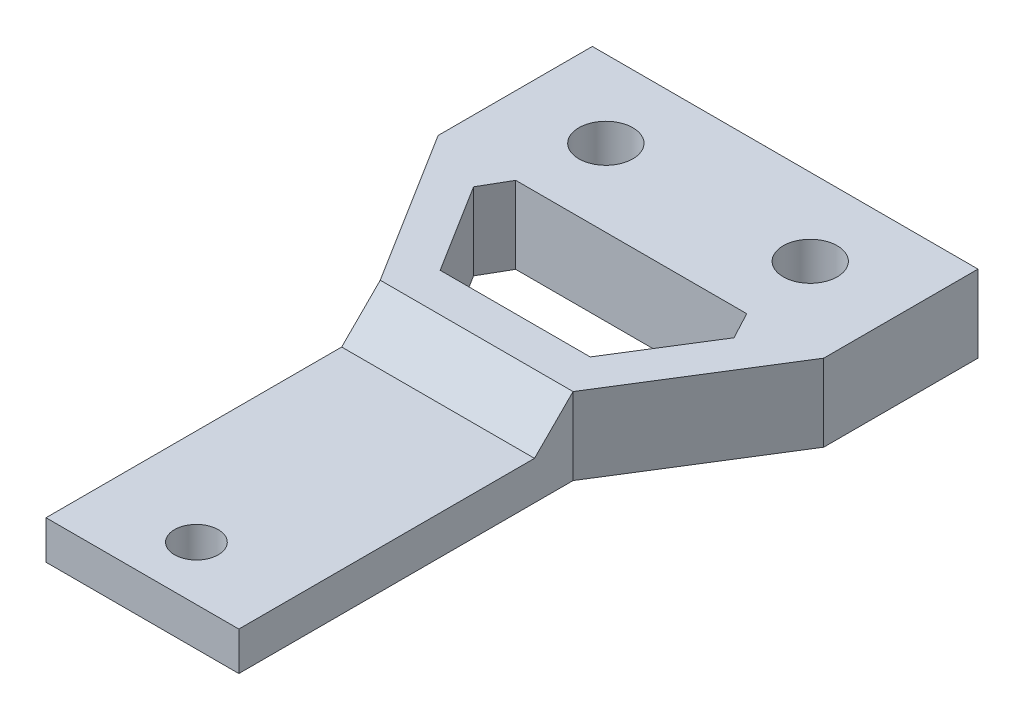
ISO-10303-21;
HEADER;
FILE_DESCRIPTION(('STEP AP214'),'2;1');
FILE_NAME('part.step','',(''),(''),'','','');
FILE_SCHEMA(('AUTOMOTIVE_DESIGN { 1 0 10303 214 1 1 1 1 }'));
ENDSEC;
DATA;
#1=APPLICATION_CONTEXT('core data for automotive mechanical design processes');
#2=APPLICATION_PROTOCOL_DEFINITION('international standard','automotive_design',2000,#1);
#3=PRODUCT_CONTEXT('',#1,'mechanical');
#4=PRODUCT('Part','Part','',(#3));
#5=PRODUCT_RELATED_PRODUCT_CATEGORY('part','',(#4));
#6=PRODUCT_DEFINITION_FORMATION('','',#4);
#7=PRODUCT_DEFINITION_CONTEXT('part definition',#1,'design');
#8=PRODUCT_DEFINITION('design','',#6,#7);
#9=PRODUCT_DEFINITION_SHAPE('','',#8);
#10=(LENGTH_UNIT() NAMED_UNIT(*) SI_UNIT(.MILLI.,.METRE.));
#11=(NAMED_UNIT(*) PLANE_ANGLE_UNIT() SI_UNIT($,.RADIAN.));
#12=(NAMED_UNIT(*) SI_UNIT($,.STERADIAN.) SOLID_ANGLE_UNIT());
#13=UNCERTAINTY_MEASURE_WITH_UNIT(LENGTH_MEASURE(1.E-05),#10,'distance_accuracy_value','');
#14=(GEOMETRIC_REPRESENTATION_CONTEXT(3) GLOBAL_UNCERTAINTY_ASSIGNED_CONTEXT((#13)) GLOBAL_UNIT_ASSIGNED_CONTEXT((#10,
#11,#12)) REPRESENTATION_CONTEXT('',''));
#15=CARTESIAN_POINT('',(0.,0.,0.));
#16=DIRECTION('',(0.,0.,1.));
#17=DIRECTION('',(1.,0.,0.));
#18=AXIS2_PLACEMENT_3D('',#15,#16,#17);
#19=CARTESIAN_POINT('',(-15.,6.,0.));
#20=DIRECTION('',(1.,0.,0.));
#21=DIRECTION('',(0.,0.,-1.));
#22=AXIS2_PLACEMENT_3D('',#19,#20,#21);
#23=PLANE('',#22);
#24=DIRECTION('',(0.,0.,1.));
#25=VECTOR('',#24,1.);
#26=CARTESIAN_POINT('',(-15.,0.,0.));
#27=LINE('',#26,#25);
#28=CARTESIAN_POINT('',(-15.,0.,-20.));
#29=VERTEX_POINT('',#28);
#30=CARTESIAN_POINT('',(-15.,0.,-8.));
#31=VERTEX_POINT('',#30);
#32=EDGE_CURVE('E292',#29,#31,#27,.T.);
#33=ORIENTED_EDGE('',*,*,#32,.T.);
#34=DIRECTION('',(0.,-1.,0.));
#35=VECTOR('',#34,1.);
#36=CARTESIAN_POINT('',(-15.,6.,-8.));
#37=LINE('',#36,#35);
#38=CARTESIAN_POINT('',(-15.,6.,-8.));
#39=VERTEX_POINT('',#38);
#40=EDGE_CURVE('E320',#39,#31,#37,.T.);
#41=ORIENTED_EDGE('',*,*,#40,.F.);
#42=DIRECTION('',(0.,0.,1.));
#43=VECTOR('',#42,1.);
#44=CARTESIAN_POINT('',(-15.,6.,0.));
#45=LINE('',#44,#43);
#46=CARTESIAN_POINT('',(-15.,6.,-20.));
#47=VERTEX_POINT('',#46);
#48=EDGE_CURVE('E257',#47,#39,#45,.T.);
#49=ORIENTED_EDGE('',*,*,#48,.F.);
#50=DIRECTION('',(0.,-1.,0.));
#51=VECTOR('',#50,1.);
#52=CARTESIAN_POINT('',(-15.,6.,-20.));
#53=LINE('',#52,#51);
#54=EDGE_CURVE('E281',#47,#29,#53,.T.);
#55=ORIENTED_EDGE('',*,*,#54,.T.);
#56=EDGE_LOOP('',(#33,#41,#49,#55));
#57=FACE_BOUND('',#56,.T.);
#58=ADVANCED_FACE('F47',(#57),#23,.F.);
#59=CARTESIAN_POINT('',(-7.19101123595505,6.,4.49438202247191));
#60=DIRECTION('',(0.847998304005088,0.,-0.52999894000318));
#61=DIRECTION('',(-0.52999894000318,0.,-0.847998304005088));
#62=AXIS2_PLACEMENT_3D('',#59,#60,#61);
#63=PLANE('',#62);
#64=DIRECTION('',(0.52999894000318,0.,0.847998304005088));
#65=VECTOR('',#64,1.);
#66=CARTESIAN_POINT('',(-7.19101123595505,0.,4.49438202247191));
#67=LINE('',#66,#65);
#68=CARTESIAN_POINT('',(-7.5,0.,4.));
#69=VERTEX_POINT('',#68);
#70=EDGE_CURVE('E293',#31,#69,#67,.T.);
#71=ORIENTED_EDGE('',*,*,#70,.T.);
#72=DIRECTION('',(0.,-1.,0.));
#73=VECTOR('',#72,1.);
#74=CARTESIAN_POINT('',(-7.5,3.,4.));
#75=LINE('',#74,#73);
#76=CARTESIAN_POINT('',(-7.5,6.,4.));
#77=VERTEX_POINT('',#76);
#78=EDGE_CURVE('E241',#77,#69,#75,.T.);
#79=ORIENTED_EDGE('',*,*,#78,.F.);
#80=DIRECTION('',(0.52999894000318,0.,0.847998304005088));
#81=VECTOR('',#80,1.);
#82=CARTESIAN_POINT('',(-7.19101123595505,6.,4.49438202247191));
#83=LINE('',#82,#81);
#84=EDGE_CURVE('E262',#39,#77,#83,.T.);
#85=ORIENTED_EDGE('',*,*,#84,.F.);
#86=ORIENTED_EDGE('',*,*,#40,.T.);
#87=EDGE_LOOP('',(#71,#79,#85,#86));
#88=FACE_BOUND('',#87,.T.);
#89=ADVANCED_FACE('F375',(#88),#63,.F.);
#90=CARTESIAN_POINT('',(7.19101123595506,6.,4.49438202247191));
#91=DIRECTION('',(0.847998304005088,0.,0.52999894000318));
#92=DIRECTION('',(0.52999894000318,0.,-0.847998304005088));
#93=AXIS2_PLACEMENT_3D('',#90,#91,#92);
#94=PLANE('',#93);
#95=DIRECTION('',(-0.52999894000318,0.,0.847998304005088));
#96=VECTOR('',#95,1.);
#97=CARTESIAN_POINT('',(7.19101123595506,0.,4.49438202247191));
#98=LINE('',#97,#96);
#99=CARTESIAN_POINT('',(15.,0.,-8.));
#100=VERTEX_POINT('',#99);
#101=CARTESIAN_POINT('',(7.5,0.,4.));
#102=VERTEX_POINT('',#101);
#103=EDGE_CURVE('E296',#100,#102,#98,.T.);
#104=ORIENTED_EDGE('',*,*,#103,.F.);
#105=DIRECTION('',(0.,-1.,0.));
#106=VECTOR('',#105,1.);
#107=CARTESIAN_POINT('',(15.,6.,-8.));
#108=LINE('',#107,#106);
#109=CARTESIAN_POINT('',(15.,6.,-8.));
#110=VERTEX_POINT('',#109);
#111=EDGE_CURVE('E314',#110,#100,#108,.T.);
#112=ORIENTED_EDGE('',*,*,#111,.F.);
#113=DIRECTION('',(-0.52999894000318,0.,0.847998304005088));
#114=VECTOR('',#113,1.);
#115=CARTESIAN_POINT('',(7.19101123595506,6.,4.49438202247191));
#116=LINE('',#115,#114);
#117=CARTESIAN_POINT('',(7.5,5.99999999999999,4.));
#118=VERTEX_POINT('',#117);
#119=EDGE_CURVE('E275',#110,#118,#116,.T.);
#120=ORIENTED_EDGE('',*,*,#119,.T.);
#121=DIRECTION('',(0.,-1.,0.));
#122=VECTOR('',#121,1.);
#123=CARTESIAN_POINT('',(7.5,3.,4.));
#124=LINE('',#123,#122);
#125=EDGE_CURVE('E250',#118,#102,#124,.T.);
#126=ORIENTED_EDGE('',*,*,#125,.T.);
#127=EDGE_LOOP('',(#104,#112,#120,#126));
#128=FACE_BOUND('',#127,.T.);
#129=ADVANCED_FACE('F377',(#128),#94,.T.);
#130=CARTESIAN_POINT('',(15.,6.,0.));
#131=DIRECTION('',(1.,0.,0.));
#132=DIRECTION('',(0.,0.,-1.));
#133=AXIS2_PLACEMENT_3D('',#130,#131,#132);
#134=PLANE('',#133);
#135=DIRECTION('',(0.,0.,1.));
#136=VECTOR('',#135,1.);
#137=CARTESIAN_POINT('',(15.,0.,0.));
#138=LINE('',#137,#136);
#139=CARTESIAN_POINT('',(15.,0.,-20.));
#140=VERTEX_POINT('',#139);
#141=EDGE_CURVE('E305',#140,#100,#138,.T.);
#142=ORIENTED_EDGE('',*,*,#141,.F.);
#143=DIRECTION('',(0.,-1.,0.));
#144=VECTOR('',#143,1.);
#145=CARTESIAN_POINT('',(15.,6.,-20.));
#146=LINE('',#145,#144);
#147=CARTESIAN_POINT('',(15.,6.,-20.));
#148=VERTEX_POINT('',#147);
#149=EDGE_CURVE('E313',#148,#140,#146,.T.);
#150=ORIENTED_EDGE('',*,*,#149,.F.);
#151=DIRECTION('',(0.,0.,1.));
#152=VECTOR('',#151,1.);
#153=CARTESIAN_POINT('',(15.,6.,0.));
#154=LINE('',#153,#152);
#155=EDGE_CURVE('E277',#148,#110,#154,.T.);
#156=ORIENTED_EDGE('',*,*,#155,.T.);
#157=ORIENTED_EDGE('',*,*,#111,.T.);
#158=EDGE_LOOP('',(#142,#150,#156,#157));
#159=FACE_BOUND('',#158,.T.);
#160=ADVANCED_FACE('F389',(#159),#134,.T.);
#161=CARTESIAN_POINT('',(7.95,6.,-14.));
#162=DIRECTION('',(0.,-1.,0.));
#163=DIRECTION('',(0.,0.,-1.));
#164=AXIS2_PLACEMENT_3D('',#161,#162,#163);
#165=CYLINDRICAL_SURFACE('',#164,2.1);
#166=CARTESIAN_POINT('',(7.95,6.,-14.));
#167=DIRECTION('',(0.,1.,0.));
#168=DIRECTION('',(0.,0.,1.));
#169=AXIS2_PLACEMENT_3D('',#166,#167,#168);
#170=CIRCLE('',#169,2.1);
#171=CARTESIAN_POINT('',(7.95,6.,-11.9));
#172=VERTEX_POINT('',#171);
#173=EDGE_CURVE('E254',#172,#172,#170,.T.);
#174=ORIENTED_EDGE('',*,*,#173,.T.);
#175=EDGE_LOOP('',(#174));
#176=FACE_BOUND('',#175,.T.);
#177=CARTESIAN_POINT('',(7.95,0.,-14.));
#178=DIRECTION('',(0.,1.,0.));
#179=DIRECTION('',(0.,0.,1.));
#180=AXIS2_PLACEMENT_3D('',#177,#178,#179);
#181=CIRCLE('',#180,2.1);
#182=CARTESIAN_POINT('',(7.95,0.,-11.9));
#183=VERTEX_POINT('',#182);
#184=EDGE_CURVE('E290',#183,#183,#181,.T.);
#185=ORIENTED_EDGE('',*,*,#184,.F.);
#186=EDGE_LOOP('',(#185));
#187=FACE_BOUND('',#186,.T.);
#188=ADVANCED_FACE('F383',(#176,#187),#165,.F.);
#189=CARTESIAN_POINT('',(-7.95000000000001,6.,-14.));
#190=DIRECTION('',(0.,-1.,0.));
#191=DIRECTION('',(0.,0.,-1.));
#192=AXIS2_PLACEMENT_3D('',#189,#190,#191);
#193=CYLINDRICAL_SURFACE('',#192,2.1);
#194=CARTESIAN_POINT('',(-7.95000000000001,6.,-14.));
#195=DIRECTION('',(0.,1.,0.));
#196=DIRECTION('',(0.,0.,1.));
#197=AXIS2_PLACEMENT_3D('',#194,#195,#196);
#198=CIRCLE('',#197,2.1);
#199=CARTESIAN_POINT('',(-7.95000000000001,6.,-11.9));
#200=VERTEX_POINT('',#199);
#201=EDGE_CURVE('E253',#200,#200,#198,.T.);
#202=ORIENTED_EDGE('',*,*,#201,.T.);
#203=EDGE_LOOP('',(#202));
#204=FACE_BOUND('',#203,.T.);
#205=CARTESIAN_POINT('',(-7.95000000000001,0.,-14.));
#206=DIRECTION('',(0.,1.,0.));
#207=DIRECTION('',(0.,0.,1.));
#208=AXIS2_PLACEMENT_3D('',#205,#206,#207);
#209=CIRCLE('',#208,2.1);
#210=CARTESIAN_POINT('',(-7.95000000000001,0.,-11.9));
#211=VERTEX_POINT('',#210);
#212=EDGE_CURVE('E246',#211,#211,#209,.T.);
#213=ORIENTED_EDGE('',*,*,#212,.F.);
#214=EDGE_LOOP('',(#213));
#215=FACE_BOUND('',#214,.T.);
#216=ADVANCED_FACE('F390',(#204,#215),#193,.F.);
#217=CARTESIAN_POINT('',(0.,6.,-20.));
#218=DIRECTION('',(0.,0.,1.));
#219=DIRECTION('',(1.,0.,0.));
#220=AXIS2_PLACEMENT_3D('',#217,#218,#219);
#221=PLANE('',#220);
#222=DIRECTION('',(-1.,0.,0.));
#223=VECTOR('',#222,1.);
#224=CARTESIAN_POINT('',(0.,0.,-20.));
#225=LINE('',#224,#223);
#226=EDGE_CURVE('E258',#140,#29,#225,.T.);
#227=ORIENTED_EDGE('',*,*,#226,.T.);
#228=ORIENTED_EDGE('',*,*,#54,.F.);
#229=DIRECTION('',(-1.,0.,0.));
#230=VECTOR('',#229,1.);
#231=CARTESIAN_POINT('',(0.,6.,-20.));
#232=LINE('',#231,#230);
#233=EDGE_CURVE('E278',#148,#47,#232,.T.);
#234=ORIENTED_EDGE('',*,*,#233,.F.);
#235=ORIENTED_EDGE('',*,*,#149,.T.);
#236=EDGE_LOOP('',(#227,#228,#234,#235));
#237=FACE_BOUND('',#236,.T.);
#238=ADVANCED_FACE('F393',(#237),#221,.F.);
#239=CARTESIAN_POINT('',(0.,6.,0.));
#240=DIRECTION('',(0.,1.,0.));
#241=DIRECTION('',(0.,0.,1.));
#242=AXIS2_PLACEMENT_3D('',#239,#240,#241);
#243=PLANE('',#242);
#244=DIRECTION('',(1.,0.,0.));
#245=VECTOR('',#244,1.);
#246=CARTESIAN_POINT('',(-5.83725707547878,6.,0.999999999999996));
#247=LINE('',#246,#245);
#248=CARTESIAN_POINT('',(-5.83725707547878,6.,0.999999999999996));
#249=VERTEX_POINT('',#248);
#250=CARTESIAN_POINT('',(5.83725707547877,6.,0.999999999999997));
#251=VERTEX_POINT('',#250);
#252=EDGE_CURVE('E163',#249,#251,#247,.T.);
#253=ORIENTED_EDGE('',*,*,#252,.F.);
#254=DIRECTION('',(0.52999894000318,0.,0.847998304005088));
#255=VECTOR('',#254,1.);
#256=CARTESIAN_POINT('',(-11.4622570754788,6.,-8.));
#257=LINE('',#256,#255);
#258=CARTESIAN_POINT('',(-10.1627189624686,6.,-5.92073901918367));
#259=VERTEX_POINT('',#258);
#260=EDGE_CURVE('E183',#259,#249,#257,.T.);
#261=ORIENTED_EDGE('',*,*,#260,.F.);
#262=DIRECTION('',(-0.499999999999996,0.,0.866025403784441));
#263=VECTOR('',#262,1.);
#264=CARTESIAN_POINT('',(-10.1627189624686,6.,-5.92073901918367));
#265=LINE('',#264,#263);
#266=CARTESIAN_POINT('',(-8.96225707547878,6.,-8.));
#267=VERTEX_POINT('',#266);
#268=EDGE_CURVE('E56',#259,#267,#265,.F.);
#269=ORIENTED_EDGE('',*,*,#268,.T.);
#270=DIRECTION('',(-1.,0.,0.));
#271=VECTOR('',#270,1.);
#272=CARTESIAN_POINT('',(11.4622570754788,6.,-8.));
#273=LINE('',#272,#271);
#274=CARTESIAN_POINT('',(9.01029346777341,6.,-8.));
#275=VERTEX_POINT('',#274);
#276=EDGE_CURVE('E186',#275,#267,#273,.T.);
#277=ORIENTED_EDGE('',*,*,#276,.F.);
#278=DIRECTION('',(-0.46938860363294,0.,-0.88299169802412));
#279=VECTOR('',#278,1.);
#280=CARTESIAN_POINT('',(9.01029346777341,6.,-8.));
#281=LINE('',#280,#279);
#282=CARTESIAN_POINT('',(10.1372597254708,6.,-5.88000423998728));
#283=VERTEX_POINT('',#282);
#284=EDGE_CURVE('E344',#275,#283,#281,.F.);
#285=ORIENTED_EDGE('',*,*,#284,.T.);
#286=DIRECTION('',(0.52999894000318,0.,-0.847998304005088));
#287=VECTOR('',#286,1.);
#288=CARTESIAN_POINT('',(5.83725707547877,6.,0.999999999999997));
#289=LINE('',#288,#287);
#290=EDGE_CURVE('E197',#251,#283,#289,.T.);
#291=ORIENTED_EDGE('',*,*,#290,.F.);
#292=EDGE_LOOP('',(#253,#261,#269,#277,#285,#291));
#293=FACE_BOUND('',#292,.T.);
#294=ORIENTED_EDGE('',*,*,#201,.F.);
#295=EDGE_LOOP('',(#294));
#296=FACE_BOUND('',#295,.T.);
#297=ORIENTED_EDGE('',*,*,#173,.F.);
#298=EDGE_LOOP('',(#297));
#299=FACE_BOUND('',#298,.T.);
#300=ORIENTED_EDGE('',*,*,#48,.T.);
#301=ORIENTED_EDGE('',*,*,#84,.T.);
#302=DIRECTION('',(-1.,0.,0.));
#303=VECTOR('',#302,1.);
#304=CARTESIAN_POINT('',(0.,6.,4.));
#305=LINE('',#304,#303);
#306=EDGE_CURVE('E268',#118,#77,#305,.T.);
#307=ORIENTED_EDGE('',*,*,#306,.F.);
#308=ORIENTED_EDGE('',*,*,#119,.F.);
#309=ORIENTED_EDGE('',*,*,#155,.F.);
#310=ORIENTED_EDGE('',*,*,#233,.T.);
#311=EDGE_LOOP('',(#300,#301,#307,#308,#309,#310));
#312=FACE_BOUND('',#311,.T.);
#313=ADVANCED_FACE('F351',(#293,#296,#299,#312),#243,.T.);
#314=CARTESIAN_POINT('',(0.,0.,0.));
#315=DIRECTION('',(0.,1.,0.));
#316=DIRECTION('',(0.,0.,1.));
#317=AXIS2_PLACEMENT_3D('',#314,#315,#316);
#318=PLANE('',#317);
#319=DIRECTION('',(-1.,0.,0.));
#320=VECTOR('',#319,1.);
#321=CARTESIAN_POINT('',(11.4622570754788,0.,-8.));
#322=LINE('',#321,#320);
#323=CARTESIAN_POINT('',(9.01029346777341,0.,-8.));
#324=VERTEX_POINT('',#323);
#325=CARTESIAN_POINT('',(-8.96225707547878,0.,-8.));
#326=VERTEX_POINT('',#325);
#327=EDGE_CURVE('E179',#324,#326,#322,.T.);
#328=ORIENTED_EDGE('',*,*,#327,.T.);
#329=DIRECTION('',(0.499999999999996,0.,-0.866025403784441));
#330=VECTOR('',#329,1.);
#331=CARTESIAN_POINT('',(-10.1857944217469,0.,-5.88077115130567));
#332=LINE('',#331,#330);
#333=CARTESIAN_POINT('',(-10.1627189624686,0.,-5.92073901918367));
#334=VERTEX_POINT('',#333);
#335=EDGE_CURVE('E11',#326,#334,#332,.F.);
#336=ORIENTED_EDGE('',*,*,#335,.T.);
#337=DIRECTION('',(0.52999894000318,0.,0.847998304005088));
#338=VECTOR('',#337,1.);
#339=CARTESIAN_POINT('',(-11.4622570754788,0.,-8.));
#340=LINE('',#339,#338);
#341=CARTESIAN_POINT('',(-5.83725707547878,0.,0.999999999999996));
#342=VERTEX_POINT('',#341);
#343=EDGE_CURVE('E168',#334,#342,#340,.T.);
#344=ORIENTED_EDGE('',*,*,#343,.T.);
#345=DIRECTION('',(1.,0.,0.));
#346=VECTOR('',#345,1.);
#347=CARTESIAN_POINT('',(-5.83725707547878,0.,0.999999999999996));
#348=LINE('',#347,#346);
#349=CARTESIAN_POINT('',(5.83725707547877,0.,0.999999999999997));
#350=VERTEX_POINT('',#349);
#351=EDGE_CURVE('E165',#342,#350,#348,.T.);
#352=ORIENTED_EDGE('',*,*,#351,.T.);
#353=DIRECTION('',(0.52999894000318,0.,-0.847998304005088));
#354=VECTOR('',#353,1.);
#355=CARTESIAN_POINT('',(5.83725707547877,0.,0.999999999999997));
#356=LINE('',#355,#354);
#357=CARTESIAN_POINT('',(10.1372597254708,0.,-5.88000423998728));
#358=VERTEX_POINT('',#357);
#359=EDGE_CURVE('E171',#350,#358,#356,.T.);
#360=ORIENTED_EDGE('',*,*,#359,.T.);
#361=DIRECTION('',(0.46938860363294,0.,0.88299169802412));
#362=VECTOR('',#361,1.);
#363=CARTESIAN_POINT('',(10.3408245229358,0.,-5.49706774604523));
#364=LINE('',#363,#362);
#365=EDGE_CURVE('E350',#358,#324,#364,.F.);
#366=ORIENTED_EDGE('',*,*,#365,.T.);
#367=EDGE_LOOP('',(#328,#336,#344,#352,#360,#366));
#368=FACE_BOUND('',#367,.T.);
#369=ORIENTED_EDGE('',*,*,#212,.T.);
#370=EDGE_LOOP('',(#369));
#371=FACE_BOUND('',#370,.T.);
#372=ORIENTED_EDGE('',*,*,#184,.T.);
#373=EDGE_LOOP('',(#372));
#374=FACE_BOUND('',#373,.T.);
#375=ORIENTED_EDGE('',*,*,#32,.F.);
#376=ORIENTED_EDGE('',*,*,#226,.F.);
#377=ORIENTED_EDGE('',*,*,#141,.T.);
#378=ORIENTED_EDGE('',*,*,#103,.T.);
#379=DIRECTION('',(0.,0.,-1.));
#380=VECTOR('',#379,1.);
#381=CARTESIAN_POINT('',(7.5,0.,0.));
#382=LINE('',#381,#380);
#383=CARTESIAN_POINT('',(7.5,0.,30.));
#384=VERTEX_POINT('',#383);
#385=EDGE_CURVE('E230',#384,#102,#382,.T.);
#386=ORIENTED_EDGE('',*,*,#385,.F.);
#387=DIRECTION('',(-1.,0.,0.));
#388=VECTOR('',#387,1.);
#389=CARTESIAN_POINT('',(0.,0.,30.));
#390=LINE('',#389,#388);
#391=CARTESIAN_POINT('',(-7.5,0.,30.));
#392=VERTEX_POINT('',#391);
#393=EDGE_CURVE('E211',#384,#392,#390,.T.);
#394=ORIENTED_EDGE('',*,*,#393,.T.);
#395=DIRECTION('',(0.,0.,-1.));
#396=VECTOR('',#395,1.);
#397=CARTESIAN_POINT('',(-7.5,0.,0.));
#398=LINE('',#397,#396);
#399=EDGE_CURVE('E232',#392,#69,#398,.T.);
#400=ORIENTED_EDGE('',*,*,#399,.T.);
#401=ORIENTED_EDGE('',*,*,#70,.F.);
#402=EDGE_LOOP('',(#375,#376,#377,#378,#386,#394,#400,#401));
#403=FACE_BOUND('',#402,.T.);
#404=CARTESIAN_POINT('',(0.,0.,25.8));
#405=DIRECTION('',(0.,1.,0.));
#406=DIRECTION('',(0.,0.,1.));
#407=AXIS2_PLACEMENT_3D('',#404,#405,#406);
#408=CIRCLE('',#407,1.7);
#409=CARTESIAN_POINT('',(0.,0.,27.5));
#410=VERTEX_POINT('',#409);
#411=EDGE_CURVE('E204',#410,#410,#408,.T.);
#412=ORIENTED_EDGE('',*,*,#411,.T.);
#413=EDGE_LOOP('',(#412));
#414=FACE_BOUND('',#413,.T.);
#415=ADVANCED_FACE('F182',(#368,#371,#374,#403,#414),#318,.F.);
#416=CARTESIAN_POINT('',(7.5,3.,0.));
#417=DIRECTION('',(-1.,0.,0.));
#418=DIRECTION('',(0.,0.,1.));
#419=AXIS2_PLACEMENT_3D('',#416,#417,#418);
#420=PLANE('',#419);
#421=ORIENTED_EDGE('',*,*,#385,.T.);
#422=ORIENTED_EDGE('',*,*,#125,.F.);
#423=DIRECTION('',(0.,0.707106781186544,-0.707106781186551));
#424=VECTOR('',#423,1.);
#425=CARTESIAN_POINT('',(7.5,6.50000000000001,3.49999999999997));
#426=LINE('',#425,#424);
#427=CARTESIAN_POINT('',(7.5,3.,7.00000000000001));
#428=VERTEX_POINT('',#427);
#429=EDGE_CURVE('E328',#118,#428,#426,.F.);
#430=ORIENTED_EDGE('',*,*,#429,.T.);
#431=DIRECTION('',(0.,0.,-1.));
#432=VECTOR('',#431,1.);
#433=CARTESIAN_POINT('',(7.5,3.,0.));
#434=LINE('',#433,#432);
#435=CARTESIAN_POINT('',(7.5,3.,30.));
#436=VERTEX_POINT('',#435);
#437=EDGE_CURVE('E209',#436,#428,#434,.T.);
#438=ORIENTED_EDGE('',*,*,#437,.F.);
#439=DIRECTION('',(0.,-1.,0.));
#440=VECTOR('',#439,1.);
#441=CARTESIAN_POINT('',(7.5,3.,30.));
#442=LINE('',#441,#440);
#443=EDGE_CURVE('E224',#436,#384,#442,.T.);
#444=ORIENTED_EDGE('',*,*,#443,.T.);
#445=EDGE_LOOP('',(#421,#422,#430,#438,#444));
#446=FACE_BOUND('',#445,.T.);
#447=ADVANCED_FACE('F413',(#446),#420,.F.);
#448=CARTESIAN_POINT('',(-7.5,3.,0.));
#449=DIRECTION('',(-1.,0.,0.));
#450=DIRECTION('',(0.,0.,1.));
#451=AXIS2_PLACEMENT_3D('',#448,#449,#450);
#452=PLANE('',#451);
#453=ORIENTED_EDGE('',*,*,#399,.F.);
#454=DIRECTION('',(0.,-1.,0.));
#455=VECTOR('',#454,1.);
#456=CARTESIAN_POINT('',(-7.5,3.,30.));
#457=LINE('',#456,#455);
#458=CARTESIAN_POINT('',(-7.5,3.,30.));
#459=VERTEX_POINT('',#458);
#460=EDGE_CURVE('E238',#459,#392,#457,.T.);
#461=ORIENTED_EDGE('',*,*,#460,.F.);
#462=DIRECTION('',(0.,0.,-1.));
#463=VECTOR('',#462,1.);
#464=CARTESIAN_POINT('',(-7.5,3.,0.));
#465=LINE('',#464,#463);
#466=CARTESIAN_POINT('',(-7.5,3.,7.00000000000001));
#467=VERTEX_POINT('',#466);
#468=EDGE_CURVE('E214',#459,#467,#465,.T.);
#469=ORIENTED_EDGE('',*,*,#468,.T.);
#470=DIRECTION('',(0.,-0.707106781186544,0.707106781186551));
#471=VECTOR('',#470,1.);
#472=CARTESIAN_POINT('',(-7.5,3.,7.00000000000001));
#473=LINE('',#472,#471);
#474=EDGE_CURVE('E324',#467,#77,#473,.F.);
#475=ORIENTED_EDGE('',*,*,#474,.T.);
#476=ORIENTED_EDGE('',*,*,#78,.T.);
#477=EDGE_LOOP('',(#453,#461,#469,#475,#476));
#478=FACE_BOUND('',#477,.T.);
#479=ADVANCED_FACE('F437',(#478),#452,.T.);
#480=CARTESIAN_POINT('',(0.,3.,25.8));
#481=DIRECTION('',(0.,-1.,0.));
#482=DIRECTION('',(0.,0.,-1.));
#483=AXIS2_PLACEMENT_3D('',#480,#481,#482);
#484=CYLINDRICAL_SURFACE('',#483,1.7);
#485=CARTESIAN_POINT('',(0.,3.,25.8));
#486=DIRECTION('',(0.,1.,0.));
#487=DIRECTION('',(0.,0.,1.));
#488=AXIS2_PLACEMENT_3D('',#485,#486,#487);
#489=CIRCLE('',#488,1.7);
#490=CARTESIAN_POINT('',(0.,3.,27.5));
#491=VERTEX_POINT('',#490);
#492=EDGE_CURVE('E206',#491,#491,#489,.T.);
#493=ORIENTED_EDGE('',*,*,#492,.T.);
#494=EDGE_LOOP('',(#493));
#495=FACE_BOUND('',#494,.T.);
#496=ORIENTED_EDGE('',*,*,#411,.F.);
#497=EDGE_LOOP('',(#496));
#498=FACE_BOUND('',#497,.T.);
#499=ADVANCED_FACE('F439',(#495,#498),#484,.F.);
#500=CARTESIAN_POINT('',(0.,3.,30.));
#501=DIRECTION('',(0.,0.,1.));
#502=DIRECTION('',(1.,0.,0.));
#503=AXIS2_PLACEMENT_3D('',#500,#501,#502);
#504=PLANE('',#503);
#505=ORIENTED_EDGE('',*,*,#393,.F.);
#506=ORIENTED_EDGE('',*,*,#443,.F.);
#507=DIRECTION('',(-1.,0.,0.));
#508=VECTOR('',#507,1.);
#509=CARTESIAN_POINT('',(0.,3.,30.));
#510=LINE('',#509,#508);
#511=EDGE_CURVE('E218',#436,#459,#510,.T.);
#512=ORIENTED_EDGE('',*,*,#511,.T.);
#513=ORIENTED_EDGE('',*,*,#460,.T.);
#514=EDGE_LOOP('',(#505,#506,#512,#513));
#515=FACE_BOUND('',#514,.T.);
#516=ADVANCED_FACE('F403',(#515),#504,.T.);
#517=CARTESIAN_POINT('',(0.,3.,0.));
#518=DIRECTION('',(0.,1.,0.));
#519=DIRECTION('',(0.,0.,1.));
#520=AXIS2_PLACEMENT_3D('',#517,#518,#519);
#521=PLANE('',#520);
#522=ORIENTED_EDGE('',*,*,#492,.F.);
#523=EDGE_LOOP('',(#522));
#524=FACE_BOUND('',#523,.T.);
#525=ORIENTED_EDGE('',*,*,#437,.T.);
#526=DIRECTION('',(-1.,0.,0.));
#527=VECTOR('',#526,1.);
#528=CARTESIAN_POINT('',(-7.5,3.,7.00000000000001));
#529=LINE('',#528,#527);
#530=EDGE_CURVE('E321',#428,#467,#529,.T.);
#531=ORIENTED_EDGE('',*,*,#530,.T.);
#532=ORIENTED_EDGE('',*,*,#468,.F.);
#533=ORIENTED_EDGE('',*,*,#511,.F.);
#534=EDGE_LOOP('',(#525,#531,#532,#533));
#535=FACE_BOUND('',#534,.T.);
#536=ADVANCED_FACE('F398',(#524,#535),#521,.T.);
#537=CARTESIAN_POINT('',(0.,3.,7.00000000000001));
#538=DIRECTION('',(0.,0.707106781186551,0.707106781186544));
#539=DIRECTION('',(1.,0.,0.));
#540=AXIS2_PLACEMENT_3D('',#537,#538,#539);
#541=PLANE('',#540);
#542=ORIENTED_EDGE('',*,*,#429,.F.);
#543=ORIENTED_EDGE('',*,*,#306,.T.);
#544=ORIENTED_EDGE('',*,*,#474,.F.);
#545=ORIENTED_EDGE('',*,*,#530,.F.);
#546=EDGE_LOOP('',(#542,#543,#544,#545));
#547=FACE_BOUND('',#546,.T.);
#548=ADVANCED_FACE('F392',(#547),#541,.T.);
#549=CARTESIAN_POINT('',(-5.83725707547878,0.,0.999999999999996));
#550=DIRECTION('',(0.,0.,1.));
#551=DIRECTION('',(1.,0.,0.));
#552=AXIS2_PLACEMENT_3D('',#549,#550,#551);
#553=PLANE('',#552);
#554=ORIENTED_EDGE('',*,*,#252,.T.);
#555=DIRECTION('',(0.,1.,0.));
#556=VECTOR('',#555,1.);
#557=CARTESIAN_POINT('',(5.83725707547877,0.,0.999999999999997));
#558=LINE('',#557,#556);
#559=EDGE_CURVE('E160',#350,#251,#558,.T.);
#560=ORIENTED_EDGE('',*,*,#559,.F.);
#561=ORIENTED_EDGE('',*,*,#351,.F.);
#562=DIRECTION('',(0.,1.,0.));
#563=VECTOR('',#562,1.);
#564=CARTESIAN_POINT('',(-5.83725707547878,0.,0.999999999999996));
#565=LINE('',#564,#563);
#566=EDGE_CURVE('E166',#342,#249,#565,.T.);
#567=ORIENTED_EDGE('',*,*,#566,.T.);
#568=EDGE_LOOP('',(#554,#560,#561,#567));
#569=FACE_BOUND('',#568,.T.);
#570=ADVANCED_FACE('F157',(#569),#553,.F.);
#571=CARTESIAN_POINT('',(-11.4622570754788,0.,-8.));
#572=DIRECTION('',(-0.847998304005088,0.,0.52999894000318));
#573=DIRECTION('',(0.52999894000318,0.,0.847998304005088));
#574=AXIS2_PLACEMENT_3D('',#571,#572,#573);
#575=PLANE('',#574);
#576=ORIENTED_EDGE('',*,*,#343,.F.);
#577=DIRECTION('',(0.,1.,0.));
#578=VECTOR('',#577,1.);
#579=CARTESIAN_POINT('',(-10.1627189624686,6.,-5.92073901918367));
#580=LINE('',#579,#578);
#581=EDGE_CURVE('E342',#334,#259,#580,.T.);
#582=ORIENTED_EDGE('',*,*,#581,.T.);
#583=ORIENTED_EDGE('',*,*,#260,.T.);
#584=ORIENTED_EDGE('',*,*,#566,.F.);
#585=EDGE_LOOP('',(#576,#582,#583,#584));
#586=FACE_BOUND('',#585,.T.);
#587=ADVANCED_FACE('F356',(#586),#575,.F.);
#588=CARTESIAN_POINT('',(11.4622570754788,0.,-8.));
#589=DIRECTION('',(0.,0.,-1.));
#590=DIRECTION('',(-1.,0.,0.));
#591=AXIS2_PLACEMENT_3D('',#588,#589,#590);
#592=PLANE('',#591);
#593=ORIENTED_EDGE('',*,*,#327,.F.);
#594=DIRECTION('',(0.,1.,0.));
#595=VECTOR('',#594,1.);
#596=CARTESIAN_POINT('',(9.01029346777341,6.,-8.));
#597=LINE('',#596,#595);
#598=EDGE_CURVE('E333',#324,#275,#597,.T.);
#599=ORIENTED_EDGE('',*,*,#598,.T.);
#600=ORIENTED_EDGE('',*,*,#276,.T.);
#601=DIRECTION('',(0.,-1.,0.));
#602=VECTOR('',#601,1.);
#603=CARTESIAN_POINT('',(-8.96225707547878,0.,-8.));
#604=LINE('',#603,#602);
#605=EDGE_CURVE('E335',#267,#326,#604,.T.);
#606=ORIENTED_EDGE('',*,*,#605,.T.);
#607=EDGE_LOOP('',(#593,#599,#600,#606));
#608=FACE_BOUND('',#607,.T.);
#609=ADVANCED_FACE('F360',(#608),#592,.F.);
#610=CARTESIAN_POINT('',(5.83725707547877,0.,0.999999999999997));
#611=DIRECTION('',(0.847998304005088,0.,0.52999894000318));
#612=DIRECTION('',(0.52999894000318,0.,-0.847998304005088));
#613=AXIS2_PLACEMENT_3D('',#610,#611,#612);
#614=PLANE('',#613);
#615=ORIENTED_EDGE('',*,*,#290,.T.);
#616=DIRECTION('',(0.,-1.,0.));
#617=VECTOR('',#616,1.);
#618=CARTESIAN_POINT('',(10.1372597254708,0.,-5.88000423998728));
#619=LINE('',#618,#617);
#620=EDGE_CURVE('E177',#283,#358,#619,.T.);
#621=ORIENTED_EDGE('',*,*,#620,.T.);
#622=ORIENTED_EDGE('',*,*,#359,.F.);
#623=ORIENTED_EDGE('',*,*,#559,.T.);
#624=EDGE_LOOP('',(#615,#621,#622,#623));
#625=FACE_BOUND('',#624,.T.);
#626=ADVANCED_FACE('F172',(#625),#614,.F.);
#627=CARTESIAN_POINT('',(9.01029346777341,0.,-8.));
#628=DIRECTION('',(-0.88299169802412,0.,0.46938860363294));
#629=DIRECTION('',(0.,-1.,0.));
#630=AXIS2_PLACEMENT_3D('',#627,#628,#629);
#631=PLANE('',#630);
#632=ORIENTED_EDGE('',*,*,#365,.F.);
#633=ORIENTED_EDGE('',*,*,#620,.F.);
#634=ORIENTED_EDGE('',*,*,#284,.F.);
#635=ORIENTED_EDGE('',*,*,#598,.F.);
#636=EDGE_LOOP('',(#632,#633,#634,#635));
#637=FACE_BOUND('',#636,.T.);
#638=ADVANCED_FACE('F362',(#637),#631,.T.);
#639=CARTESIAN_POINT('',(-10.1627189624686,0.,-5.92073901918367));
#640=DIRECTION('',(0.866025403784441,0.,0.499999999999996));
#641=DIRECTION('',(0.,-1.,0.));
#642=AXIS2_PLACEMENT_3D('',#639,#640,#641);
#643=PLANE('',#642);
#644=ORIENTED_EDGE('',*,*,#335,.F.);
#645=ORIENTED_EDGE('',*,*,#605,.F.);
#646=ORIENTED_EDGE('',*,*,#268,.F.);
#647=ORIENTED_EDGE('',*,*,#581,.F.);
#648=EDGE_LOOP('',(#644,#645,#646,#647));
#649=FACE_BOUND('',#648,.T.);
#650=ADVANCED_FACE('F55',(#649),#643,.T.);
#651=CLOSED_SHELL('',(#58,#89,#129,#160,#188,#216,#238,#313,#415,#447,#479,#499,#516,#536,#548,
#570,#587,#609,#626,#638,#650));
#652=MANIFOLD_SOLID_BREP('B2',#651);
#653=ADVANCED_BREP_SHAPE_REPRESENTATION('',(#18,#652),#14);
#654=SHAPE_DEFINITION_REPRESENTATION(#9,#653);
ENDSEC;
END-ISO-10303-21;
